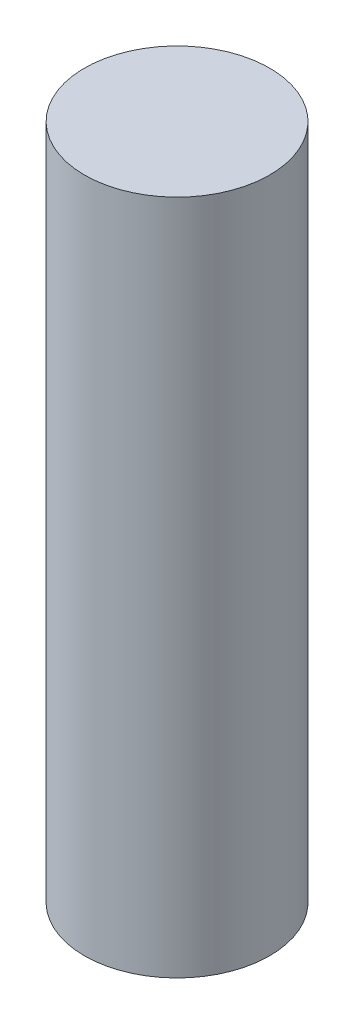
ISO-10303-21;
HEADER;
FILE_DESCRIPTION(('STEP AP214'),'2;1');
FILE_NAME('part.step','',(''),(''),'','','');
FILE_SCHEMA(('AUTOMOTIVE_DESIGN { 1 0 10303 214 1 1 1 1 }'));
ENDSEC;
DATA;
#1=APPLICATION_CONTEXT('core data for automotive mechanical design processes');
#2=APPLICATION_PROTOCOL_DEFINITION('international standard','automotive_design',2000,#1);
#3=PRODUCT_CONTEXT('',#1,'mechanical');
#4=PRODUCT('Part','Part','',(#3));
#5=PRODUCT_RELATED_PRODUCT_CATEGORY('part','',(#4));
#6=PRODUCT_DEFINITION_FORMATION('','',#4);
#7=PRODUCT_DEFINITION_CONTEXT('part definition',#1,'design');
#8=PRODUCT_DEFINITION('design','',#6,#7);
#9=PRODUCT_DEFINITION_SHAPE('','',#8);
#10=(LENGTH_UNIT() NAMED_UNIT(*) SI_UNIT(.MILLI.,.METRE.));
#11=(NAMED_UNIT(*) PLANE_ANGLE_UNIT() SI_UNIT($,.RADIAN.));
#12=(NAMED_UNIT(*) SI_UNIT($,.STERADIAN.) SOLID_ANGLE_UNIT());
#13=UNCERTAINTY_MEASURE_WITH_UNIT(LENGTH_MEASURE(1.E-05),#10,'distance_accuracy_value','');
#14=(GEOMETRIC_REPRESENTATION_CONTEXT(3) GLOBAL_UNCERTAINTY_ASSIGNED_CONTEXT((#13)) GLOBAL_UNIT_ASSIGNED_CONTEXT((#10,
#11,#12)) REPRESENTATION_CONTEXT('',''));
#15=CARTESIAN_POINT('',(0.,0.,0.));
#16=DIRECTION('',(0.,0.,1.));
#17=DIRECTION('',(1.,0.,0.));
#18=AXIS2_PLACEMENT_3D('',#15,#16,#17);
#19=CARTESIAN_POINT('',(0.,11.5,0.));
#20=DIRECTION('',(0.,-1.,0.));
#21=DIRECTION('',(0.,0.,-1.));
#22=AXIS2_PLACEMENT_3D('',#19,#20,#21);
#23=CYLINDRICAL_SURFACE('',#22,3.15);
#24=CARTESIAN_POINT('',(0.,11.5,0.));
#25=DIRECTION('',(0.,1.,0.));
#26=DIRECTION('',(0.,0.,1.));
#27=AXIS2_PLACEMENT_3D('',#24,#25,#26);
#28=CIRCLE('',#27,3.15);
#29=CARTESIAN_POINT('',(0.,11.5,3.15));
#30=VERTEX_POINT('',#29);
#31=EDGE_CURVE('E10',#30,#30,#28,.T.);
#32=ORIENTED_EDGE('',*,*,#31,.F.);
#33=EDGE_LOOP('',(#32));
#34=FACE_BOUND('',#33,.T.);
#35=CARTESIAN_POINT('',(0.,-11.5,0.));
#36=DIRECTION('',(0.,1.,0.));
#37=DIRECTION('',(0.,0.,1.));
#38=AXIS2_PLACEMENT_3D('',#35,#36,#37);
#39=CIRCLE('',#38,3.15);
#40=CARTESIAN_POINT('',(0.,-11.5,3.15));
#41=VERTEX_POINT('',#40);
#42=EDGE_CURVE('E34',#41,#41,#39,.T.);
#43=ORIENTED_EDGE('',*,*,#42,.T.);
#44=EDGE_LOOP('',(#43));
#45=FACE_BOUND('',#44,.T.);
#46=ADVANCED_FACE('F31',(#34,#45),#23,.T.);
#47=CARTESIAN_POINT('',(0.,11.5,0.));
#48=DIRECTION('',(0.,1.,0.));
#49=DIRECTION('',(0.,0.,1.));
#50=AXIS2_PLACEMENT_3D('',#47,#48,#49);
#51=PLANE('',#50);
#52=ORIENTED_EDGE('',*,*,#31,.T.);
#53=EDGE_LOOP('',(#52));
#54=FACE_BOUND('',#53,.T.);
#55=ADVANCED_FACE('F46',(#54),#51,.T.);
#56=CARTESIAN_POINT('',(0.,-11.5,0.));
#57=DIRECTION('',(0.,1.,0.));
#58=DIRECTION('',(0.,0.,1.));
#59=AXIS2_PLACEMENT_3D('',#56,#57,#58);
#60=PLANE('',#59);
#61=ORIENTED_EDGE('',*,*,#42,.F.);
#62=EDGE_LOOP('',(#61));
#63=FACE_BOUND('',#62,.T.);
#64=ADVANCED_FACE('F44',(#63),#60,.F.);
#65=CLOSED_SHELL('',(#46,#55,#64));
#66=MANIFOLD_SOLID_BREP('B2',#65);
#67=ADVANCED_BREP_SHAPE_REPRESENTATION('',(#18,#66),#14);
#68=SHAPE_DEFINITION_REPRESENTATION(#9,#67);
ENDSEC;
END-ISO-10303-21;
